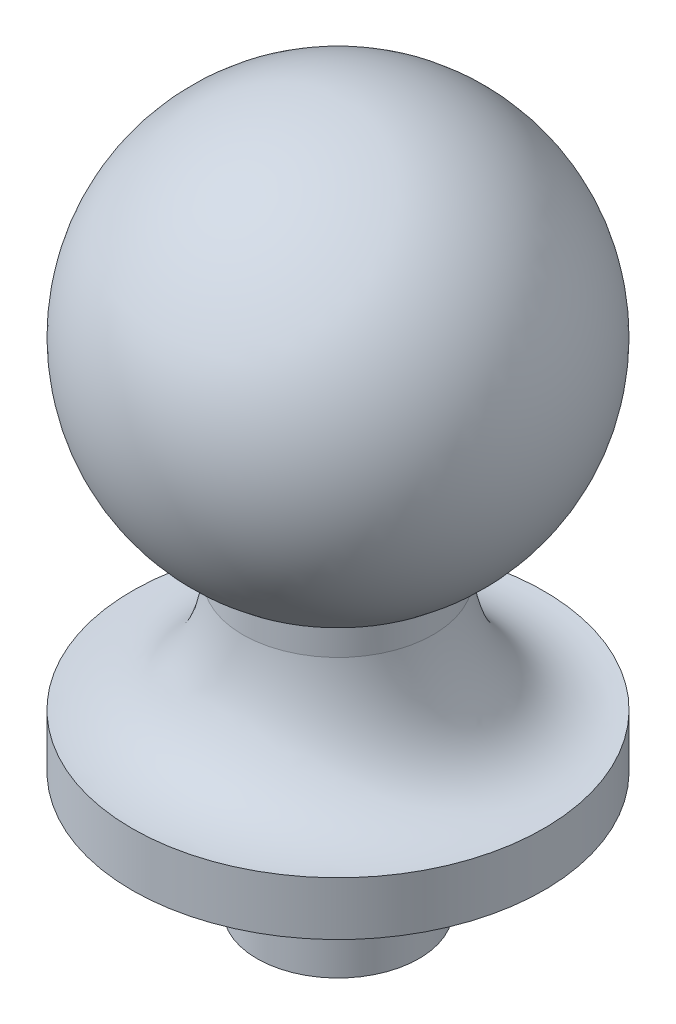
ISO-10303-21;
HEADER;
FILE_DESCRIPTION(('STEP AP214'),'2;1');
FILE_NAME('part.step','',(''),(''),'','','');
FILE_SCHEMA(('AUTOMOTIVE_DESIGN { 1 0 10303 214 1 1 1 1 }'));
ENDSEC;
DATA;
#1=APPLICATION_CONTEXT('core data for automotive mechanical design processes');
#2=APPLICATION_PROTOCOL_DEFINITION('international standard','automotive_design',2000,#1);
#3=PRODUCT_CONTEXT('',#1,'mechanical');
#4=PRODUCT('Part','Part','',(#3));
#5=PRODUCT_RELATED_PRODUCT_CATEGORY('part','',(#4));
#6=PRODUCT_DEFINITION_FORMATION('','',#4);
#7=PRODUCT_DEFINITION_CONTEXT('part definition',#1,'design');
#8=PRODUCT_DEFINITION('design','',#6,#7);
#9=PRODUCT_DEFINITION_SHAPE('','',#8);
#10=(LENGTH_UNIT() NAMED_UNIT(*) SI_UNIT(.MILLI.,.METRE.));
#11=(NAMED_UNIT(*) PLANE_ANGLE_UNIT() SI_UNIT($,.RADIAN.));
#12=(NAMED_UNIT(*) SI_UNIT($,.STERADIAN.) SOLID_ANGLE_UNIT());
#13=UNCERTAINTY_MEASURE_WITH_UNIT(LENGTH_MEASURE(1.E-05),#10,'distance_accuracy_value','');
#14=(GEOMETRIC_REPRESENTATION_CONTEXT(3) GLOBAL_UNCERTAINTY_ASSIGNED_CONTEXT((#13)) GLOBAL_UNIT_ASSIGNED_CONTEXT((#10,
#11,#12)) REPRESENTATION_CONTEXT('',''));
#15=CARTESIAN_POINT('',(0.,0.,0.));
#16=DIRECTION('',(0.,0.,1.));
#17=DIRECTION('',(1.,0.,0.));
#18=AXIS2_PLACEMENT_3D('',#15,#16,#17);
#19=CARTESIAN_POINT('',(0.,0.,0.));
#20=DIRECTION('',(0.,1.,0.));
#21=DIRECTION('',(0.,0.,-1.));
#22=AXIS2_PLACEMENT_3D('',#19,#20,#21);
#23=SPHERICAL_SURFACE('',#22,25.4);
#24=CARTESIAN_POINT('',(0.,-22.5166898841685,0.));
#25=DIRECTION('',(0.,1.,0.));
#26=DIRECTION('',(0.,0.,1.));
#27=AXIS2_PLACEMENT_3D('',#24,#25,#26);
#28=CIRCLE('',#27,11.7540919113382);
#29=CARTESIAN_POINT('',(0.,-22.5166898841685,11.7540919113382));
#30=VERTEX_POINT('',#29);
#31=EDGE_CURVE('E10',#30,#30,#28,.T.);
#32=ORIENTED_EDGE('',*,*,#31,.T.);
#33=EDGE_LOOP('',(#32));
#34=FACE_BOUND('',#33,.T.);
#35=ADVANCED_FACE('F32',(#34),#23,.T.);
#36=CARTESIAN_POINT('',(0.,38.9559636280055,0.));
#37=DIRECTION('',(0.,1.,0.));
#38=DIRECTION('',(0.,0.,1.));
#39=AXIS2_PLACEMENT_3D('',#36,#37,#38);
#40=CYLINDRICAL_SURFACE('',#39,11.7540919113382);
#41=CARTESIAN_POINT('',(0.,-25.9539627730211,0.));
#42=DIRECTION('',(0.,1.,0.));
#43=DIRECTION('',(0.,0.,1.));
#44=AXIS2_PLACEMENT_3D('',#41,#42,#43);
#45=CIRCLE('',#44,11.7540919113382);
#46=CARTESIAN_POINT('',(0.,-25.9539627730211,11.7540919113382));
#47=VERTEX_POINT('',#46);
#48=EDGE_CURVE('E38',#47,#47,#45,.T.);
#49=ORIENTED_EDGE('',*,*,#48,.T.);
#50=EDGE_LOOP('',(#49));
#51=FACE_BOUND('',#50,.T.);
#52=ORIENTED_EDGE('',*,*,#31,.F.);
#53=EDGE_LOOP('',(#52));
#54=FACE_BOUND('',#53,.T.);
#55=ADVANCED_FACE('F68',(#51,#54),#40,.T.);
#56=CARTESIAN_POINT('',(0.,-25.9539627730211,11.7540919113382));
#57=CARTESIAN_POINT('',(0.,-40.663791468697,13.6251243718311));
#58=CARTESIAN_POINT('',(0.,-39.8463482134642,25.4));
#59=B_SPLINE_CURVE_WITH_KNOTS('',2,(#56,#57,#58),.UNSPECIFIED.,.F.,.F.,(3,3),(0.,1.),.UNSPECIFIED.);
#60=CARTESIAN_POINT('',(0.,38.9559636280055,0.));
#61=DIRECTION('',(0.,1.,0.));
#62=AXIS1_PLACEMENT('',#60,#61);
#63=SURFACE_OF_REVOLUTION('',#59,#62);
#64=CARTESIAN_POINT('',(0.,-39.8463482134642,0.));
#65=DIRECTION('',(0.,1.,0.));
#66=DIRECTION('',(0.,0.,1.));
#67=AXIS2_PLACEMENT_3D('',#64,#65,#66);
#68=CIRCLE('',#67,25.4);
#69=CARTESIAN_POINT('',(0.,-39.8463482134642,25.4));
#70=VERTEX_POINT('',#69);
#71=EDGE_CURVE('E42',#70,#70,#68,.T.);
#72=ORIENTED_EDGE('',*,*,#71,.T.);
#73=EDGE_LOOP('',(#72));
#74=FACE_BOUND('',#73,.T.);
#75=ORIENTED_EDGE('',*,*,#48,.F.);
#76=EDGE_LOOP('',(#75));
#77=FACE_BOUND('',#76,.T.);
#78=ADVANCED_FACE('F64',(#74,#77),#63,.F.);
#79=CARTESIAN_POINT('',(0.,38.9559636280055,0.));
#80=DIRECTION('',(0.,1.,0.));
#81=DIRECTION('',(0.,0.,1.));
#82=AXIS2_PLACEMENT_3D('',#79,#80,#81);
#83=CYLINDRICAL_SURFACE('',#82,25.4);
#84=CARTESIAN_POINT('',(0.,-46.4531468024277,0.));
#85=DIRECTION('',(0.,1.,0.));
#86=DIRECTION('',(0.,0.,1.));
#87=AXIS2_PLACEMENT_3D('',#84,#85,#86);
#88=CIRCLE('',#87,25.4);
#89=CARTESIAN_POINT('',(0.,-46.4531468024277,25.4));
#90=VERTEX_POINT('',#89);
#91=EDGE_CURVE('E46',#90,#90,#88,.T.);
#92=ORIENTED_EDGE('',*,*,#91,.T.);
#93=EDGE_LOOP('',(#92));
#94=FACE_BOUND('',#93,.T.);
#95=ORIENTED_EDGE('',*,*,#71,.F.);
#96=EDGE_LOOP('',(#95));
#97=FACE_BOUND('',#96,.T.);
#98=ADVANCED_FACE('F67',(#94,#97),#83,.T.);
#99=CARTESIAN_POINT('',(0.,-46.4531468024277,0.));
#100=DIRECTION('',(0.,-1.,0.));
#101=DIRECTION('',(0.,0.,-1.));
#102=AXIS2_PLACEMENT_3D('',#99,#100,#101);
#103=PLANE('',#102);
#104=CARTESIAN_POINT('',(0.,-46.4531468024277,0.));
#105=DIRECTION('',(0.,1.,0.));
#106=DIRECTION('',(0.,0.,1.));
#107=AXIS2_PLACEMENT_3D('',#104,#105,#106);
#108=CIRCLE('',#107,10.);
#109=CARTESIAN_POINT('',(0.,-46.4531468024277,10.));
#110=VERTEX_POINT('',#109);
#111=EDGE_CURVE('E51',#110,#110,#108,.T.);
#112=ORIENTED_EDGE('',*,*,#111,.T.);
#113=EDGE_LOOP('',(#112));
#114=FACE_BOUND('',#113,.T.);
#115=ORIENTED_EDGE('',*,*,#91,.F.);
#116=EDGE_LOOP('',(#115));
#117=FACE_BOUND('',#116,.T.);
#118=ADVANCED_FACE('F97',(#114,#117),#103,.T.);
#119=CARTESIAN_POINT('',(0.,38.9559636280055,0.));
#120=DIRECTION('',(0.,1.,0.));
#121=DIRECTION('',(0.,0.,1.));
#122=AXIS2_PLACEMENT_3D('',#119,#120,#121);
#123=CYLINDRICAL_SURFACE('',#122,10.);
#124=CARTESIAN_POINT('',(0.,-61.4531468024277,0.));
#125=DIRECTION('',(0.,1.,0.));
#126=DIRECTION('',(0.,0.,1.));
#127=AXIS2_PLACEMENT_3D('',#124,#125,#126);
#128=CIRCLE('',#127,10.);
#129=CARTESIAN_POINT('',(0.,-61.4531468024277,10.));
#130=VERTEX_POINT('',#129);
#131=EDGE_CURVE('E54',#130,#130,#128,.T.);
#132=ORIENTED_EDGE('',*,*,#131,.T.);
#133=EDGE_LOOP('',(#132));
#134=FACE_BOUND('',#133,.T.);
#135=ORIENTED_EDGE('',*,*,#111,.F.);
#136=EDGE_LOOP('',(#135));
#137=FACE_BOUND('',#136,.T.);
#138=ADVANCED_FACE('F106',(#134,#137),#123,.T.);
#139=CARTESIAN_POINT('',(0.,-61.4531468024277,0.));
#140=DIRECTION('',(0.,-1.,0.));
#141=DIRECTION('',(0.,0.,-1.));
#142=AXIS2_PLACEMENT_3D('',#139,#140,#141);
#143=PLANE('',#142);
#144=ORIENTED_EDGE('',*,*,#131,.F.);
#145=EDGE_LOOP('',(#144));
#146=FACE_BOUND('',#145,.T.);
#147=ADVANCED_FACE('F115',(#146),#143,.T.);
#148=CLOSED_SHELL('',(#35,#55,#78,#98,#118,#138,#147));
#149=MANIFOLD_SOLID_BREP('B2',#148);
#150=ADVANCED_BREP_SHAPE_REPRESENTATION('',(#18,#149),#14);
#151=SHAPE_DEFINITION_REPRESENTATION(#9,#150);
ENDSEC;
END-ISO-10303-21;
